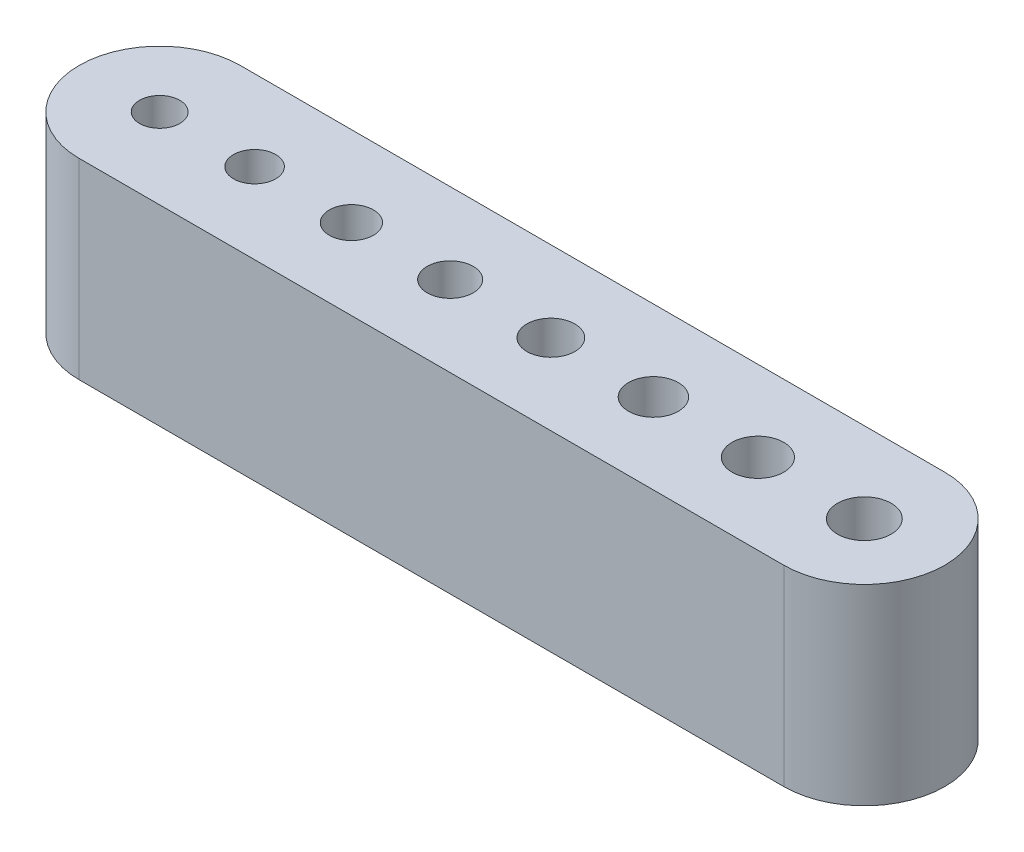
ISO-10303-21;
HEADER;
FILE_DESCRIPTION(('STEP AP214'),'2;1');
FILE_NAME('part.step','',(''),(''),'','','');
FILE_SCHEMA(('AUTOMOTIVE_DESIGN { 1 0 10303 214 1 1 1 1 }'));
ENDSEC;
DATA;
#1=APPLICATION_CONTEXT('core data for automotive mechanical design processes');
#2=APPLICATION_PROTOCOL_DEFINITION('international standard','automotive_design',2000,#1);
#3=PRODUCT_CONTEXT('',#1,'mechanical');
#4=PRODUCT('Part','Part','',(#3));
#5=PRODUCT_RELATED_PRODUCT_CATEGORY('part','',(#4));
#6=PRODUCT_DEFINITION_FORMATION('','',#4);
#7=PRODUCT_DEFINITION_CONTEXT('part definition',#1,'design');
#8=PRODUCT_DEFINITION('design','',#6,#7);
#9=PRODUCT_DEFINITION_SHAPE('','',#8);
#10=(LENGTH_UNIT() NAMED_UNIT(*) SI_UNIT(.MILLI.,.METRE.));
#11=(NAMED_UNIT(*) PLANE_ANGLE_UNIT() SI_UNIT($,.RADIAN.));
#12=(NAMED_UNIT(*) SI_UNIT($,.STERADIAN.) SOLID_ANGLE_UNIT());
#13=UNCERTAINTY_MEASURE_WITH_UNIT(LENGTH_MEASURE(1.E-05),#10,'distance_accuracy_value','');
#14=(GEOMETRIC_REPRESENTATION_CONTEXT(3) GLOBAL_UNCERTAINTY_ASSIGNED_CONTEXT((#13)) GLOBAL_UNIT_ASSIGNED_CONTEXT((#10,
#11,#12)) REPRESENTATION_CONTEXT('',''));
#15=CARTESIAN_POINT('',(0.,0.,0.));
#16=DIRECTION('',(0.,0.,1.));
#17=DIRECTION('',(1.,0.,0.));
#18=AXIS2_PLACEMENT_3D('',#15,#16,#17);
#19=CARTESIAN_POINT('',(-18.375,10.,0.));
#20=DIRECTION('',(0.,1.,0.));
#21=DIRECTION('',(0.,0.,1.));
#22=AXIS2_PLACEMENT_3D('',#19,#20,#21);
#23=PLANE('',#22);
#24=CARTESIAN_POINT('',(12.825,10.,0.));
#25=DIRECTION('',(0.,1.,0.));
#26=DIRECTION('',(0.,0.,1.));
#27=AXIS2_PLACEMENT_3D('',#24,#25,#26);
#28=CIRCLE('',#27,1.35);
#29=CARTESIAN_POINT('',(12.825,10.,1.35));
#30=VERTEX_POINT('',#29);
#31=EDGE_CURVE('E145',#30,#30,#28,.T.);
#32=ORIENTED_EDGE('',*,*,#31,.F.);
#33=EDGE_LOOP('',(#32));
#34=FACE_BOUND('',#33,.T.);
#35=CARTESIAN_POINT('',(2.025,10.,0.));
#36=DIRECTION('',(0.,1.,0.));
#37=DIRECTION('',(0.,0.,1.));
#38=AXIS2_PLACEMENT_3D('',#35,#36,#37);
#39=CIRCLE('',#38,1.25);
#40=CARTESIAN_POINT('',(2.025,10.,1.25));
#41=VERTEX_POINT('',#40);
#42=EDGE_CURVE('E133',#41,#41,#39,.T.);
#43=ORIENTED_EDGE('',*,*,#42,.F.);
#44=EDGE_LOOP('',(#43));
#45=FACE_BOUND('',#44,.T.);
#46=CARTESIAN_POINT('',(-8.375,10.,0.));
#47=DIRECTION('',(0.,1.,0.));
#48=DIRECTION('',(0.,0.,1.));
#49=AXIS2_PLACEMENT_3D('',#46,#47,#48);
#50=CIRCLE('',#49,1.15);
#51=CARTESIAN_POINT('',(-8.375,10.,1.15));
#52=VERTEX_POINT('',#51);
#53=EDGE_CURVE('E121',#52,#52,#50,.T.);
#54=ORIENTED_EDGE('',*,*,#53,.F.);
#55=EDGE_LOOP('',(#54));
#56=FACE_BOUND('',#55,.T.);
#57=CARTESIAN_POINT('',(-18.375,10.,0.));
#58=DIRECTION('',(0.,1.,0.));
#59=DIRECTION('',(0.,0.,1.));
#60=AXIS2_PLACEMENT_3D('',#57,#58,#59);
#61=CIRCLE('',#60,1.05);
#62=CARTESIAN_POINT('',(-18.375,10.,1.05));
#63=VERTEX_POINT('',#62);
#64=EDGE_CURVE('E100',#63,#63,#61,.T.);
#65=ORIENTED_EDGE('',*,*,#64,.F.);
#66=EDGE_LOOP('',(#65));
#67=FACE_BOUND('',#66,.T.);
#68=CARTESIAN_POINT('',(-18.375,10.,0.));
#69=DIRECTION('',(0.,1.,0.));
#70=DIRECTION('',(0.,0.,1.));
#71=AXIS2_PLACEMENT_3D('',#68,#69,#70);
#72=CIRCLE('',#71,4.2);
#73=CARTESIAN_POINT('',(-18.375,10.,-4.2));
#74=VERTEX_POINT('',#73);
#75=CARTESIAN_POINT('',(-18.375,10.,4.2));
#76=VERTEX_POINT('',#75);
#77=EDGE_CURVE('E85',#74,#76,#72,.T.);
#78=ORIENTED_EDGE('',*,*,#77,.T.);
#79=DIRECTION('',(1.,0.,0.));
#80=VECTOR('',#79,1.);
#81=CARTESIAN_POINT('',(-18.375,10.,4.2));
#82=LINE('',#81,#80);
#83=CARTESIAN_POINT('',(18.375,10.,4.2));
#84=VERTEX_POINT('',#83);
#85=EDGE_CURVE('E80',#76,#84,#82,.T.);
#86=ORIENTED_EDGE('',*,*,#85,.T.);
#87=CARTESIAN_POINT('',(18.375,10.,0.));
#88=DIRECTION('',(0.,1.,0.));
#89=DIRECTION('',(0.,0.,1.));
#90=AXIS2_PLACEMENT_3D('',#87,#88,#89);
#91=CIRCLE('',#90,4.2);
#92=CARTESIAN_POINT('',(18.375,10.,-4.2));
#93=VERTEX_POINT('',#92);
#94=EDGE_CURVE('E83',#84,#93,#91,.T.);
#95=ORIENTED_EDGE('',*,*,#94,.T.);
#96=DIRECTION('',(-1.,0.,0.));
#97=VECTOR('',#96,1.);
#98=CARTESIAN_POINT('',(-18.375,10.,-4.2));
#99=LINE('',#98,#97);
#100=EDGE_CURVE('E50',#93,#74,#99,.T.);
#101=ORIENTED_EDGE('',*,*,#100,.T.);
#102=EDGE_LOOP('',(#78,#86,#95,#101));
#103=FACE_BOUND('',#102,.T.);
#104=CARTESIAN_POINT('',(-13.425,10.,0.));
#105=DIRECTION('',(0.,1.,0.));
#106=DIRECTION('',(0.,0.,1.));
#107=AXIS2_PLACEMENT_3D('',#104,#105,#106);
#108=CIRCLE('',#107,1.1);
#109=CARTESIAN_POINT('',(-13.425,10.,1.1));
#110=VERTEX_POINT('',#109);
#111=EDGE_CURVE('E115',#110,#110,#108,.T.);
#112=ORIENTED_EDGE('',*,*,#111,.F.);
#113=EDGE_LOOP('',(#112));
#114=FACE_BOUND('',#113,.T.);
#115=CARTESIAN_POINT('',(-3.225,10.,0.));
#116=DIRECTION('',(0.,1.,0.));
#117=DIRECTION('',(0.,0.,1.));
#118=AXIS2_PLACEMENT_3D('',#115,#116,#117);
#119=CIRCLE('',#118,1.2);
#120=CARTESIAN_POINT('',(-3.225,10.,1.2));
#121=VERTEX_POINT('',#120);
#122=EDGE_CURVE('E127',#121,#121,#119,.T.);
#123=ORIENTED_EDGE('',*,*,#122,.F.);
#124=EDGE_LOOP('',(#123));
#125=FACE_BOUND('',#124,.T.);
#126=CARTESIAN_POINT('',(18.375,10.,0.));
#127=DIRECTION('',(0.,1.,0.));
#128=DIRECTION('',(0.,0.,1.));
#129=AXIS2_PLACEMENT_3D('',#126,#127,#128);
#130=CIRCLE('',#129,1.4);
#131=CARTESIAN_POINT('',(18.375,10.,1.4));
#132=VERTEX_POINT('',#131);
#133=EDGE_CURVE('E139',#132,#132,#130,.T.);
#134=ORIENTED_EDGE('',*,*,#133,.F.);
#135=EDGE_LOOP('',(#134));
#136=FACE_BOUND('',#135,.T.);
#137=CARTESIAN_POINT('',(7.375,10.,0.));
#138=DIRECTION('',(0.,1.,0.));
#139=DIRECTION('',(0.,0.,1.));
#140=AXIS2_PLACEMENT_3D('',#137,#138,#139);
#141=CIRCLE('',#140,1.3);
#142=CARTESIAN_POINT('',(7.375,10.,1.3));
#143=VERTEX_POINT('',#142);
#144=EDGE_CURVE('E151',#143,#143,#141,.T.);
#145=ORIENTED_EDGE('',*,*,#144,.F.);
#146=EDGE_LOOP('',(#145));
#147=FACE_BOUND('',#146,.T.);
#148=ADVANCED_FACE('F33',(#34,#45,#56,#67,#103,#114,#125,#136,#147),#23,.T.);
#149=CARTESIAN_POINT('',(-18.375,0.,0.));
#150=DIRECTION('',(0.,1.,0.));
#151=DIRECTION('',(0.,0.,1.));
#152=AXIS2_PLACEMENT_3D('',#149,#150,#151);
#153=PLANE('',#152);
#154=CARTESIAN_POINT('',(-18.375,0.,0.));
#155=DIRECTION('',(0.,1.,0.));
#156=DIRECTION('',(0.,0.,1.));
#157=AXIS2_PLACEMENT_3D('',#154,#155,#156);
#158=CIRCLE('',#157,4.2);
#159=CARTESIAN_POINT('',(-18.375,0.,-4.2));
#160=VERTEX_POINT('',#159);
#161=CARTESIAN_POINT('',(-18.375,0.,4.2));
#162=VERTEX_POINT('',#161);
#163=EDGE_CURVE('E97',#160,#162,#158,.T.);
#164=ORIENTED_EDGE('',*,*,#163,.F.);
#165=DIRECTION('',(-1.,0.,0.));
#166=VECTOR('',#165,1.);
#167=CARTESIAN_POINT('',(-18.375,0.,-4.2));
#168=LINE('',#167,#166);
#169=CARTESIAN_POINT('',(18.375,0.,-4.2));
#170=VERTEX_POINT('',#169);
#171=EDGE_CURVE('E73',#170,#160,#168,.T.);
#172=ORIENTED_EDGE('',*,*,#171,.F.);
#173=CARTESIAN_POINT('',(18.375,0.,0.));
#174=DIRECTION('',(0.,1.,0.));
#175=DIRECTION('',(0.,0.,1.));
#176=AXIS2_PLACEMENT_3D('',#173,#174,#175);
#177=CIRCLE('',#176,4.2);
#178=CARTESIAN_POINT('',(18.375,0.,4.2));
#179=VERTEX_POINT('',#178);
#180=EDGE_CURVE('E67',#179,#170,#177,.T.);
#181=ORIENTED_EDGE('',*,*,#180,.F.);
#182=DIRECTION('',(1.,0.,0.));
#183=VECTOR('',#182,1.);
#184=CARTESIAN_POINT('',(-18.375,0.,4.2));
#185=LINE('',#184,#183);
#186=EDGE_CURVE('E89',#162,#179,#185,.T.);
#187=ORIENTED_EDGE('',*,*,#186,.F.);
#188=EDGE_LOOP('',(#164,#172,#181,#187));
#189=FACE_BOUND('',#188,.T.);
#190=CARTESIAN_POINT('',(-18.375,0.,0.));
#191=DIRECTION('',(0.,1.,0.));
#192=DIRECTION('',(0.,0.,1.));
#193=AXIS2_PLACEMENT_3D('',#190,#191,#192);
#194=CIRCLE('',#193,1.05);
#195=CARTESIAN_POINT('',(-18.375,0.,1.05));
#196=VERTEX_POINT('',#195);
#197=EDGE_CURVE('E112',#196,#196,#194,.T.);
#198=ORIENTED_EDGE('',*,*,#197,.T.);
#199=EDGE_LOOP('',(#198));
#200=FACE_BOUND('',#199,.T.);
#201=CARTESIAN_POINT('',(-13.425,0.,0.));
#202=DIRECTION('',(0.,1.,0.));
#203=DIRECTION('',(0.,0.,1.));
#204=AXIS2_PLACEMENT_3D('',#201,#202,#203);
#205=CIRCLE('',#204,1.1);
#206=CARTESIAN_POINT('',(-13.425,0.,1.1));
#207=VERTEX_POINT('',#206);
#208=EDGE_CURVE('E118',#207,#207,#205,.T.);
#209=ORIENTED_EDGE('',*,*,#208,.T.);
#210=EDGE_LOOP('',(#209));
#211=FACE_BOUND('',#210,.T.);
#212=CARTESIAN_POINT('',(-8.375,0.,0.));
#213=DIRECTION('',(0.,1.,0.));
#214=DIRECTION('',(0.,0.,1.));
#215=AXIS2_PLACEMENT_3D('',#212,#213,#214);
#216=CIRCLE('',#215,1.15);
#217=CARTESIAN_POINT('',(-8.375,0.,1.15));
#218=VERTEX_POINT('',#217);
#219=EDGE_CURVE('E124',#218,#218,#216,.T.);
#220=ORIENTED_EDGE('',*,*,#219,.T.);
#221=EDGE_LOOP('',(#220));
#222=FACE_BOUND('',#221,.T.);
#223=CARTESIAN_POINT('',(-3.225,0.,0.));
#224=DIRECTION('',(0.,1.,0.));
#225=DIRECTION('',(0.,0.,1.));
#226=AXIS2_PLACEMENT_3D('',#223,#224,#225);
#227=CIRCLE('',#226,1.2);
#228=CARTESIAN_POINT('',(-3.225,0.,1.2));
#229=VERTEX_POINT('',#228);
#230=EDGE_CURVE('E130',#229,#229,#227,.T.);
#231=ORIENTED_EDGE('',*,*,#230,.T.);
#232=EDGE_LOOP('',(#231));
#233=FACE_BOUND('',#232,.T.);
#234=CARTESIAN_POINT('',(2.025,0.,0.));
#235=DIRECTION('',(0.,1.,0.));
#236=DIRECTION('',(0.,0.,1.));
#237=AXIS2_PLACEMENT_3D('',#234,#235,#236);
#238=CIRCLE('',#237,1.25);
#239=CARTESIAN_POINT('',(2.025,0.,1.25));
#240=VERTEX_POINT('',#239);
#241=EDGE_CURVE('E136',#240,#240,#238,.T.);
#242=ORIENTED_EDGE('',*,*,#241,.T.);
#243=EDGE_LOOP('',(#242));
#244=FACE_BOUND('',#243,.T.);
#245=CARTESIAN_POINT('',(18.375,0.,0.));
#246=DIRECTION('',(0.,1.,0.));
#247=DIRECTION('',(0.,0.,1.));
#248=AXIS2_PLACEMENT_3D('',#245,#246,#247);
#249=CIRCLE('',#248,1.4);
#250=CARTESIAN_POINT('',(18.375,0.,1.4));
#251=VERTEX_POINT('',#250);
#252=EDGE_CURVE('E142',#251,#251,#249,.T.);
#253=ORIENTED_EDGE('',*,*,#252,.T.);
#254=EDGE_LOOP('',(#253));
#255=FACE_BOUND('',#254,.T.);
#256=CARTESIAN_POINT('',(12.825,0.,0.));
#257=DIRECTION('',(0.,1.,0.));
#258=DIRECTION('',(0.,0.,1.));
#259=AXIS2_PLACEMENT_3D('',#256,#257,#258);
#260=CIRCLE('',#259,1.35);
#261=CARTESIAN_POINT('',(12.825,0.,1.35));
#262=VERTEX_POINT('',#261);
#263=EDGE_CURVE('E148',#262,#262,#260,.T.);
#264=ORIENTED_EDGE('',*,*,#263,.T.);
#265=EDGE_LOOP('',(#264));
#266=FACE_BOUND('',#265,.T.);
#267=CARTESIAN_POINT('',(7.375,0.,0.));
#268=DIRECTION('',(0.,1.,0.));
#269=DIRECTION('',(0.,0.,1.));
#270=AXIS2_PLACEMENT_3D('',#267,#268,#269);
#271=CIRCLE('',#270,1.3);
#272=CARTESIAN_POINT('',(7.375,0.,1.3));
#273=VERTEX_POINT('',#272);
#274=EDGE_CURVE('E154',#273,#273,#271,.T.);
#275=ORIENTED_EDGE('',*,*,#274,.T.);
#276=EDGE_LOOP('',(#275));
#277=FACE_BOUND('',#276,.T.);
#278=ADVANCED_FACE('F108',(#189,#200,#211,#222,#233,#244,#255,#266,#277),#153,.F.);
#279=CARTESIAN_POINT('',(-18.375,10.,0.));
#280=DIRECTION('',(0.,-1.,0.));
#281=DIRECTION('',(0.,0.,-1.));
#282=AXIS2_PLACEMENT_3D('',#279,#280,#281);
#283=CYLINDRICAL_SURFACE('',#282,4.2);
#284=ORIENTED_EDGE('',*,*,#163,.T.);
#285=DIRECTION('',(0.,-1.,0.));
#286=VECTOR('',#285,1.);
#287=CARTESIAN_POINT('',(-18.375,10.,4.2));
#288=LINE('',#287,#286);
#289=EDGE_CURVE('E11',#76,#162,#288,.T.);
#290=ORIENTED_EDGE('',*,*,#289,.F.);
#291=ORIENTED_EDGE('',*,*,#77,.F.);
#292=DIRECTION('',(0.,-1.,0.));
#293=VECTOR('',#292,1.);
#294=CARTESIAN_POINT('',(-18.375,10.,-4.2));
#295=LINE('',#294,#293);
#296=EDGE_CURVE('E93',#74,#160,#295,.T.);
#297=ORIENTED_EDGE('',*,*,#296,.T.);
#298=EDGE_LOOP('',(#284,#290,#291,#297));
#299=FACE_BOUND('',#298,.T.);
#300=ADVANCED_FACE('F35',(#299),#283,.T.);
#301=CARTESIAN_POINT('',(-18.375,10.,4.2));
#302=DIRECTION('',(0.,0.,-1.));
#303=DIRECTION('',(-1.,0.,0.));
#304=AXIS2_PLACEMENT_3D('',#301,#302,#303);
#305=PLANE('',#304);
#306=ORIENTED_EDGE('',*,*,#186,.T.);
#307=DIRECTION('',(0.,-1.,0.));
#308=VECTOR('',#307,1.);
#309=CARTESIAN_POINT('',(18.375,10.,4.2));
#310=LINE('',#309,#308);
#311=EDGE_CURVE('E42',#84,#179,#310,.T.);
#312=ORIENTED_EDGE('',*,*,#311,.F.);
#313=ORIENTED_EDGE('',*,*,#85,.F.);
#314=ORIENTED_EDGE('',*,*,#289,.T.);
#315=EDGE_LOOP('',(#306,#312,#313,#314));
#316=FACE_BOUND('',#315,.T.);
#317=ADVANCED_FACE('F88',(#316),#305,.F.);
#318=CARTESIAN_POINT('',(18.375,10.,0.));
#319=DIRECTION('',(0.,-1.,0.));
#320=DIRECTION('',(0.,0.,-1.));
#321=AXIS2_PLACEMENT_3D('',#318,#319,#320);
#322=CYLINDRICAL_SURFACE('',#321,4.2);
#323=ORIENTED_EDGE('',*,*,#180,.T.);
#324=DIRECTION('',(0.,-1.,0.));
#325=VECTOR('',#324,1.);
#326=CARTESIAN_POINT('',(18.375,10.,-4.2));
#327=LINE('',#326,#325);
#328=EDGE_CURVE('E90',#93,#170,#327,.T.);
#329=ORIENTED_EDGE('',*,*,#328,.F.);
#330=ORIENTED_EDGE('',*,*,#94,.F.);
#331=ORIENTED_EDGE('',*,*,#311,.T.);
#332=EDGE_LOOP('',(#323,#329,#330,#331));
#333=FACE_BOUND('',#332,.T.);
#334=ADVANCED_FACE('F91',(#333),#322,.T.);
#335=CARTESIAN_POINT('',(-18.375,10.,-4.2));
#336=DIRECTION('',(0.,0.,1.));
#337=DIRECTION('',(1.,0.,0.));
#338=AXIS2_PLACEMENT_3D('',#335,#336,#337);
#339=PLANE('',#338);
#340=ORIENTED_EDGE('',*,*,#171,.T.);
#341=ORIENTED_EDGE('',*,*,#296,.F.);
#342=ORIENTED_EDGE('',*,*,#100,.F.);
#343=ORIENTED_EDGE('',*,*,#328,.T.);
#344=EDGE_LOOP('',(#340,#341,#342,#343));
#345=FACE_BOUND('',#344,.T.);
#346=ADVANCED_FACE('F105',(#345),#339,.F.);
#347=CARTESIAN_POINT('',(-18.375,10.,0.));
#348=DIRECTION('',(0.,-1.,0.));
#349=DIRECTION('',(0.,0.,-1.));
#350=AXIS2_PLACEMENT_3D('',#347,#348,#349);
#351=CYLINDRICAL_SURFACE('',#350,1.05);
#352=ORIENTED_EDGE('',*,*,#64,.T.);
#353=EDGE_LOOP('',(#352));
#354=FACE_BOUND('',#353,.T.);
#355=ORIENTED_EDGE('',*,*,#197,.F.);
#356=EDGE_LOOP('',(#355));
#357=FACE_BOUND('',#356,.T.);
#358=ADVANCED_FACE('F173',(#354,#357),#351,.F.);
#359=CARTESIAN_POINT('',(-13.425,10.,0.));
#360=DIRECTION('',(0.,-1.,0.));
#361=DIRECTION('',(0.,0.,-1.));
#362=AXIS2_PLACEMENT_3D('',#359,#360,#361);
#363=CYLINDRICAL_SURFACE('',#362,1.1);
#364=ORIENTED_EDGE('',*,*,#111,.T.);
#365=EDGE_LOOP('',(#364));
#366=FACE_BOUND('',#365,.T.);
#367=ORIENTED_EDGE('',*,*,#208,.F.);
#368=EDGE_LOOP('',(#367));
#369=FACE_BOUND('',#368,.T.);
#370=ADVANCED_FACE('F219',(#366,#369),#363,.F.);
#371=CARTESIAN_POINT('',(-8.375,10.,0.));
#372=DIRECTION('',(0.,-1.,0.));
#373=DIRECTION('',(0.,0.,-1.));
#374=AXIS2_PLACEMENT_3D('',#371,#372,#373);
#375=CYLINDRICAL_SURFACE('',#374,1.15);
#376=ORIENTED_EDGE('',*,*,#53,.T.);
#377=EDGE_LOOP('',(#376));
#378=FACE_BOUND('',#377,.T.);
#379=ORIENTED_EDGE('',*,*,#219,.F.);
#380=EDGE_LOOP('',(#379));
#381=FACE_BOUND('',#380,.T.);
#382=ADVANCED_FACE('F227',(#378,#381),#375,.F.);
#383=CARTESIAN_POINT('',(-3.225,10.,0.));
#384=DIRECTION('',(0.,-1.,0.));
#385=DIRECTION('',(0.,0.,-1.));
#386=AXIS2_PLACEMENT_3D('',#383,#384,#385);
#387=CYLINDRICAL_SURFACE('',#386,1.2);
#388=ORIENTED_EDGE('',*,*,#122,.T.);
#389=EDGE_LOOP('',(#388));
#390=FACE_BOUND('',#389,.T.);
#391=ORIENTED_EDGE('',*,*,#230,.F.);
#392=EDGE_LOOP('',(#391));
#393=FACE_BOUND('',#392,.T.);
#394=ADVANCED_FACE('F235',(#390,#393),#387,.F.);
#395=CARTESIAN_POINT('',(2.025,10.,0.));
#396=DIRECTION('',(0.,-1.,0.));
#397=DIRECTION('',(0.,0.,-1.));
#398=AXIS2_PLACEMENT_3D('',#395,#396,#397);
#399=CYLINDRICAL_SURFACE('',#398,1.25);
#400=ORIENTED_EDGE('',*,*,#42,.T.);
#401=EDGE_LOOP('',(#400));
#402=FACE_BOUND('',#401,.T.);
#403=ORIENTED_EDGE('',*,*,#241,.F.);
#404=EDGE_LOOP('',(#403));
#405=FACE_BOUND('',#404,.T.);
#406=ADVANCED_FACE('F244',(#402,#405),#399,.F.);
#407=CARTESIAN_POINT('',(18.375,10.,0.));
#408=DIRECTION('',(0.,-1.,0.));
#409=DIRECTION('',(0.,0.,-1.));
#410=AXIS2_PLACEMENT_3D('',#407,#408,#409);
#411=CYLINDRICAL_SURFACE('',#410,1.4);
#412=ORIENTED_EDGE('',*,*,#133,.T.);
#413=EDGE_LOOP('',(#412));
#414=FACE_BOUND('',#413,.T.);
#415=ORIENTED_EDGE('',*,*,#252,.F.);
#416=EDGE_LOOP('',(#415));
#417=FACE_BOUND('',#416,.T.);
#418=ADVANCED_FACE('F253',(#414,#417),#411,.F.);
#419=CARTESIAN_POINT('',(12.825,10.,0.));
#420=DIRECTION('',(0.,-1.,0.));
#421=DIRECTION('',(0.,0.,-1.));
#422=AXIS2_PLACEMENT_3D('',#419,#420,#421);
#423=CYLINDRICAL_SURFACE('',#422,1.35);
#424=ORIENTED_EDGE('',*,*,#31,.T.);
#425=EDGE_LOOP('',(#424));
#426=FACE_BOUND('',#425,.T.);
#427=ORIENTED_EDGE('',*,*,#263,.F.);
#428=EDGE_LOOP('',(#427));
#429=FACE_BOUND('',#428,.T.);
#430=ADVANCED_FACE('F262',(#426,#429),#423,.F.);
#431=CARTESIAN_POINT('',(7.375,10.,0.));
#432=DIRECTION('',(0.,-1.,0.));
#433=DIRECTION('',(0.,0.,-1.));
#434=AXIS2_PLACEMENT_3D('',#431,#432,#433);
#435=CYLINDRICAL_SURFACE('',#434,1.3);
#436=ORIENTED_EDGE('',*,*,#144,.T.);
#437=EDGE_LOOP('',(#436));
#438=FACE_BOUND('',#437,.T.);
#439=ORIENTED_EDGE('',*,*,#274,.F.);
#440=EDGE_LOOP('',(#439));
#441=FACE_BOUND('',#440,.T.);
#442=ADVANCED_FACE('F160',(#438,#441),#435,.F.);
#443=CLOSED_SHELL('',(#148,#278,#300,#317,#334,#346,#358,#370,#382,#394,#406,#418,#430,#442));
#444=MANIFOLD_SOLID_BREP('B2',#443);
#445=ADVANCED_BREP_SHAPE_REPRESENTATION('',(#18,#444),#14);
#446=SHAPE_DEFINITION_REPRESENTATION(#9,#445);
ENDSEC;
END-ISO-10303-21;
